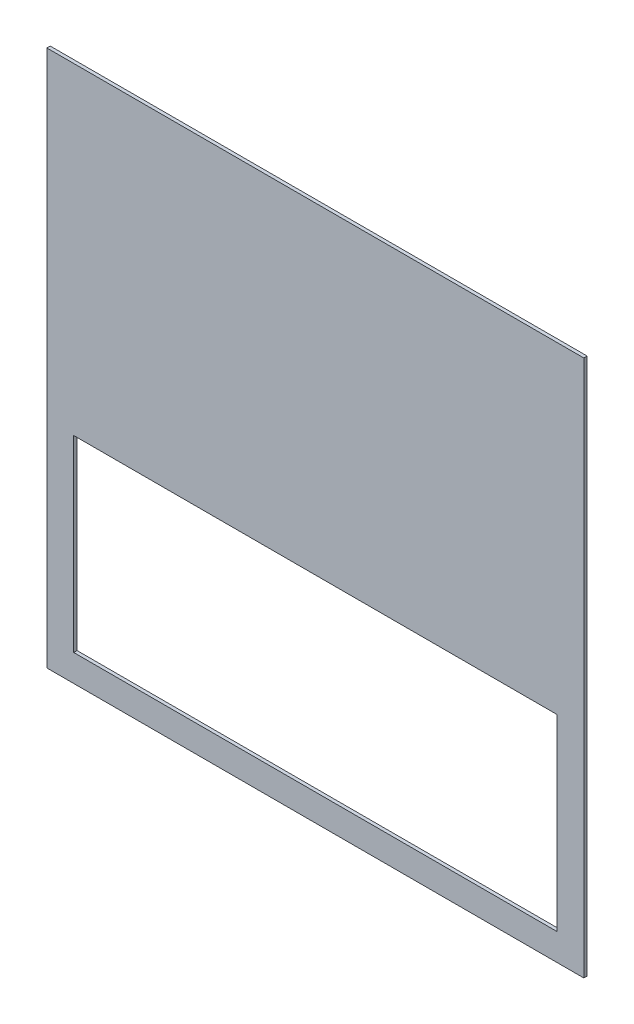
ISO-10303-21;
HEADER;
FILE_DESCRIPTION(('STEP AP214'),'2;1');
FILE_NAME('part.step','',(''),(''),'','','');
FILE_SCHEMA(('AUTOMOTIVE_DESIGN { 1 0 10303 214 1 1 1 1 }'));
ENDSEC;
DATA;
#1=APPLICATION_CONTEXT('core data for automotive mechanical design processes');
#2=APPLICATION_PROTOCOL_DEFINITION('international standard','automotive_design',2000,#1);
#3=PRODUCT_CONTEXT('',#1,'mechanical');
#4=PRODUCT('Part','Part','',(#3));
#5=PRODUCT_RELATED_PRODUCT_CATEGORY('part','',(#4));
#6=PRODUCT_DEFINITION_FORMATION('','',#4);
#7=PRODUCT_DEFINITION_CONTEXT('part definition',#1,'design');
#8=PRODUCT_DEFINITION('design','',#6,#7);
#9=PRODUCT_DEFINITION_SHAPE('','',#8);
#10=(LENGTH_UNIT() NAMED_UNIT(*) SI_UNIT(.MILLI.,.METRE.));
#11=(NAMED_UNIT(*) PLANE_ANGLE_UNIT() SI_UNIT($,.RADIAN.));
#12=(NAMED_UNIT(*) SI_UNIT($,.STERADIAN.) SOLID_ANGLE_UNIT());
#13=UNCERTAINTY_MEASURE_WITH_UNIT(LENGTH_MEASURE(1.E-05),#10,'distance_accuracy_value','');
#14=(GEOMETRIC_REPRESENTATION_CONTEXT(3) GLOBAL_UNCERTAINTY_ASSIGNED_CONTEXT((#13)) GLOBAL_UNIT_ASSIGNED_CONTEXT((#10,
#11,#12)) REPRESENTATION_CONTEXT('',''));
#15=CARTESIAN_POINT('',(0.,0.,0.));
#16=DIRECTION('',(0.,0.,1.));
#17=DIRECTION('',(1.,0.,0.));
#18=AXIS2_PLACEMENT_3D('',#15,#16,#17);
#19=CARTESIAN_POINT('',(254.,-254.,1.5875));
#20=DIRECTION('',(-1.,0.,0.));
#21=DIRECTION('',(0.,0.,1.));
#22=AXIS2_PLACEMENT_3D('',#19,#20,#21);
#23=PLANE('',#22);
#24=DIRECTION('',(0.,1.,0.));
#25=VECTOR('',#24,1.);
#26=CARTESIAN_POINT('',(254.,-254.,-1.5875));
#27=LINE('',#26,#25);
#28=CARTESIAN_POINT('',(254.,-254.,-1.5875));
#29=VERTEX_POINT('',#28);
#30=CARTESIAN_POINT('',(254.,254.,-1.5875));
#31=VERTEX_POINT('',#30);
#32=EDGE_CURVE('E134',#29,#31,#27,.T.);
#33=ORIENTED_EDGE('',*,*,#32,.T.);
#34=DIRECTION('',(0.,0.,-1.));
#35=VECTOR('',#34,1.);
#36=CARTESIAN_POINT('',(254.,254.,1.5875));
#37=LINE('',#36,#35);
#38=CARTESIAN_POINT('',(254.,254.,1.5875));
#39=VERTEX_POINT('',#38);
#40=EDGE_CURVE('E11',#39,#31,#37,.T.);
#41=ORIENTED_EDGE('',*,*,#40,.F.);
#42=DIRECTION('',(0.,1.,0.));
#43=VECTOR('',#42,1.);
#44=CARTESIAN_POINT('',(254.,-254.,1.5875));
#45=LINE('',#44,#43);
#46=CARTESIAN_POINT('',(254.,-254.,1.5875));
#47=VERTEX_POINT('',#46);
#48=EDGE_CURVE('E138',#47,#39,#45,.T.);
#49=ORIENTED_EDGE('',*,*,#48,.F.);
#50=DIRECTION('',(0.,0.,-1.));
#51=VECTOR('',#50,1.);
#52=CARTESIAN_POINT('',(254.,-254.,1.5875));
#53=LINE('',#52,#51);
#54=EDGE_CURVE('E148',#47,#29,#53,.T.);
#55=ORIENTED_EDGE('',*,*,#54,.T.);
#56=EDGE_LOOP('',(#33,#41,#49,#55));
#57=FACE_BOUND('',#56,.T.);
#58=ADVANCED_FACE('F37',(#57),#23,.F.);
#59=CARTESIAN_POINT('',(-254.,254.,1.5875));
#60=DIRECTION('',(0.,-1.,0.));
#61=DIRECTION('',(0.,0.,-1.));
#62=AXIS2_PLACEMENT_3D('',#59,#60,#61);
#63=PLANE('',#62);
#64=DIRECTION('',(-1.,0.,0.));
#65=VECTOR('',#64,1.);
#66=CARTESIAN_POINT('',(-254.,254.,-1.5875));
#67=LINE('',#66,#65);
#68=CARTESIAN_POINT('',(-254.,254.,-1.5875));
#69=VERTEX_POINT('',#68);
#70=EDGE_CURVE('E151',#31,#69,#67,.T.);
#71=ORIENTED_EDGE('',*,*,#70,.T.);
#72=DIRECTION('',(0.,0.,-1.));
#73=VECTOR('',#72,1.);
#74=CARTESIAN_POINT('',(-254.,254.,1.5875));
#75=LINE('',#74,#73);
#76=CARTESIAN_POINT('',(-254.,254.,1.5875));
#77=VERTEX_POINT('',#76);
#78=EDGE_CURVE('E44',#77,#69,#75,.T.);
#79=ORIENTED_EDGE('',*,*,#78,.F.);
#80=DIRECTION('',(-1.,0.,0.));
#81=VECTOR('',#80,1.);
#82=CARTESIAN_POINT('',(-254.,254.,1.5875));
#83=LINE('',#82,#81);
#84=EDGE_CURVE('E141',#39,#77,#83,.T.);
#85=ORIENTED_EDGE('',*,*,#84,.F.);
#86=ORIENTED_EDGE('',*,*,#40,.T.);
#87=EDGE_LOOP('',(#71,#79,#85,#86));
#88=FACE_BOUND('',#87,.T.);
#89=ADVANCED_FACE('F179',(#88),#63,.F.);
#90=CARTESIAN_POINT('',(-254.,-254.,1.5875));
#91=DIRECTION('',(1.,0.,0.));
#92=DIRECTION('',(0.,0.,-1.));
#93=AXIS2_PLACEMENT_3D('',#90,#91,#92);
#94=PLANE('',#93);
#95=DIRECTION('',(0.,-1.,0.));
#96=VECTOR('',#95,1.);
#97=CARTESIAN_POINT('',(-254.,-254.,-1.5875));
#98=LINE('',#97,#96);
#99=CARTESIAN_POINT('',(-254.,-254.,-1.5875));
#100=VERTEX_POINT('',#99);
#101=EDGE_CURVE('E153',#69,#100,#98,.T.);
#102=ORIENTED_EDGE('',*,*,#101,.T.);
#103=DIRECTION('',(0.,0.,-1.));
#104=VECTOR('',#103,1.);
#105=CARTESIAN_POINT('',(-254.,-254.,1.5875));
#106=LINE('',#105,#104);
#107=CARTESIAN_POINT('',(-254.,-254.,1.5875));
#108=VERTEX_POINT('',#107);
#109=EDGE_CURVE('E158',#108,#100,#106,.T.);
#110=ORIENTED_EDGE('',*,*,#109,.F.);
#111=DIRECTION('',(0.,-1.,0.));
#112=VECTOR('',#111,1.);
#113=CARTESIAN_POINT('',(-254.,-254.,1.5875));
#114=LINE('',#113,#112);
#115=EDGE_CURVE('E144',#77,#108,#114,.T.);
#116=ORIENTED_EDGE('',*,*,#115,.F.);
#117=ORIENTED_EDGE('',*,*,#78,.T.);
#118=EDGE_LOOP('',(#102,#110,#116,#117));
#119=FACE_BOUND('',#118,.T.);
#120=ADVANCED_FACE('F165',(#119),#94,.F.);
#121=CARTESIAN_POINT('',(-254.,-254.,1.5875));
#122=DIRECTION('',(0.,1.,0.));
#123=DIRECTION('',(0.,0.,1.));
#124=AXIS2_PLACEMENT_3D('',#121,#122,#123);
#125=PLANE('',#124);
#126=DIRECTION('',(1.,0.,0.));
#127=VECTOR('',#126,1.);
#128=CARTESIAN_POINT('',(-254.,-254.,-1.5875));
#129=LINE('',#128,#127);
#130=EDGE_CURVE('E142',#100,#29,#129,.T.);
#131=ORIENTED_EDGE('',*,*,#130,.T.);
#132=ORIENTED_EDGE('',*,*,#54,.F.);
#133=DIRECTION('',(1.,0.,0.));
#134=VECTOR('',#133,1.);
#135=CARTESIAN_POINT('',(-254.,-254.,1.5875));
#136=LINE('',#135,#134);
#137=EDGE_CURVE('E146',#108,#47,#136,.T.);
#138=ORIENTED_EDGE('',*,*,#137,.F.);
#139=ORIENTED_EDGE('',*,*,#109,.T.);
#140=EDGE_LOOP('',(#131,#132,#138,#139));
#141=FACE_BOUND('',#140,.T.);
#142=ADVANCED_FACE('F174',(#141),#125,.F.);
#143=CARTESIAN_POINT('',(0.,0.,1.5875));
#144=DIRECTION('',(0.,0.,-1.));
#145=DIRECTION('',(-1.,0.,0.));
#146=AXIS2_PLACEMENT_3D('',#143,#144,#145);
#147=PLANE('',#146);
#148=DIRECTION('',(1.,0.,0.));
#149=VECTOR('',#148,1.);
#150=CARTESIAN_POINT('',(228.6,-50.8,1.5875));
#151=LINE('',#150,#149);
#152=CARTESIAN_POINT('',(-228.6,-50.8,1.5875));
#153=VERTEX_POINT('',#152);
#154=CARTESIAN_POINT('',(228.6,-50.8,1.5875));
#155=VERTEX_POINT('',#154);
#156=EDGE_CURVE('E109',#153,#155,#151,.T.);
#157=ORIENTED_EDGE('',*,*,#156,.T.);
#158=DIRECTION('',(0.,-1.,0.));
#159=VECTOR('',#158,1.);
#160=CARTESIAN_POINT('',(228.6,-228.6,1.5875));
#161=LINE('',#160,#159);
#162=CARTESIAN_POINT('',(228.6,-228.6,1.5875));
#163=VERTEX_POINT('',#162);
#164=EDGE_CURVE('E103',#155,#163,#161,.T.);
#165=ORIENTED_EDGE('',*,*,#164,.T.);
#166=DIRECTION('',(-1.,0.,0.));
#167=VECTOR('',#166,1.);
#168=CARTESIAN_POINT('',(228.6,-228.6,1.5875));
#169=LINE('',#168,#167);
#170=CARTESIAN_POINT('',(-228.6,-228.6,1.5875));
#171=VERTEX_POINT('',#170);
#172=EDGE_CURVE('E112',#163,#171,#169,.T.);
#173=ORIENTED_EDGE('',*,*,#172,.T.);
#174=DIRECTION('',(0.,1.,0.));
#175=VECTOR('',#174,1.);
#176=CARTESIAN_POINT('',(-228.6,-228.6,1.5875));
#177=LINE('',#176,#175);
#178=EDGE_CURVE('E51',#171,#153,#177,.T.);
#179=ORIENTED_EDGE('',*,*,#178,.T.);
#180=EDGE_LOOP('',(#157,#165,#173,#179));
#181=FACE_BOUND('',#180,.T.);
#182=ORIENTED_EDGE('',*,*,#48,.T.);
#183=ORIENTED_EDGE('',*,*,#84,.T.);
#184=ORIENTED_EDGE('',*,*,#115,.T.);
#185=ORIENTED_EDGE('',*,*,#137,.T.);
#186=EDGE_LOOP('',(#182,#183,#184,#185));
#187=FACE_BOUND('',#186,.T.);
#188=ADVANCED_FACE('F116',(#181,#187),#147,.F.);
#189=CARTESIAN_POINT('',(0.,0.,-1.5875));
#190=DIRECTION('',(0.,0.,-1.));
#191=DIRECTION('',(-1.,0.,0.));
#192=AXIS2_PLACEMENT_3D('',#189,#190,#191);
#193=PLANE('',#192);
#194=DIRECTION('',(0.,-1.,0.));
#195=VECTOR('',#194,1.);
#196=CARTESIAN_POINT('',(228.6,-228.6,-1.5875));
#197=LINE('',#196,#195);
#198=CARTESIAN_POINT('',(228.6,-50.8,-1.5875));
#199=VERTEX_POINT('',#198);
#200=CARTESIAN_POINT('',(228.6,-228.6,-1.5875));
#201=VERTEX_POINT('',#200);
#202=EDGE_CURVE('E59',#199,#201,#197,.T.);
#203=ORIENTED_EDGE('',*,*,#202,.F.);
#204=DIRECTION('',(1.,0.,0.));
#205=VECTOR('',#204,1.);
#206=CARTESIAN_POINT('',(228.6,-50.8,-1.5875));
#207=LINE('',#206,#205);
#208=CARTESIAN_POINT('',(-228.6,-50.8,-1.5875));
#209=VERTEX_POINT('',#208);
#210=EDGE_CURVE('E119',#209,#199,#207,.T.);
#211=ORIENTED_EDGE('',*,*,#210,.F.);
#212=DIRECTION('',(0.,1.,0.));
#213=VECTOR('',#212,1.);
#214=CARTESIAN_POINT('',(-228.6,-228.6,-1.5875));
#215=LINE('',#214,#213);
#216=CARTESIAN_POINT('',(-228.6,-228.6,-1.5875));
#217=VERTEX_POINT('',#216);
#218=EDGE_CURVE('E122',#217,#209,#215,.T.);
#219=ORIENTED_EDGE('',*,*,#218,.F.);
#220=DIRECTION('',(-1.,0.,0.));
#221=VECTOR('',#220,1.);
#222=CARTESIAN_POINT('',(228.6,-228.6,-1.5875));
#223=LINE('',#222,#221);
#224=EDGE_CURVE('E128',#201,#217,#223,.T.);
#225=ORIENTED_EDGE('',*,*,#224,.F.);
#226=EDGE_LOOP('',(#203,#211,#219,#225));
#227=FACE_BOUND('',#226,.T.);
#228=ORIENTED_EDGE('',*,*,#32,.F.);
#229=ORIENTED_EDGE('',*,*,#130,.F.);
#230=ORIENTED_EDGE('',*,*,#101,.F.);
#231=ORIENTED_EDGE('',*,*,#70,.F.);
#232=EDGE_LOOP('',(#228,#229,#230,#231));
#233=FACE_BOUND('',#232,.T.);
#234=ADVANCED_FACE('F171',(#227,#233),#193,.T.);
#235=CARTESIAN_POINT('',(228.6,-228.6,1.5875));
#236=DIRECTION('',(1.,0.,0.));
#237=DIRECTION('',(0.,1.,0.));
#238=AXIS2_PLACEMENT_3D('',#235,#236,#237);
#239=PLANE('',#238);
#240=ORIENTED_EDGE('',*,*,#202,.T.);
#241=DIRECTION('',(0.,0.,-1.));
#242=VECTOR('',#241,1.);
#243=CARTESIAN_POINT('',(228.6,-228.6,1.5875));
#244=LINE('',#243,#242);
#245=EDGE_CURVE('E99',#163,#201,#244,.T.);
#246=ORIENTED_EDGE('',*,*,#245,.F.);
#247=ORIENTED_EDGE('',*,*,#164,.F.);
#248=DIRECTION('',(0.,0.,-1.));
#249=VECTOR('',#248,1.);
#250=CARTESIAN_POINT('',(228.6,-50.8,1.5875));
#251=LINE('',#250,#249);
#252=EDGE_CURVE('E132',#155,#199,#251,.T.);
#253=ORIENTED_EDGE('',*,*,#252,.T.);
#254=EDGE_LOOP('',(#240,#246,#247,#253));
#255=FACE_BOUND('',#254,.T.);
#256=ADVANCED_FACE('F101',(#255),#239,.F.);
#257=CARTESIAN_POINT('',(228.6,-50.8,1.5875));
#258=DIRECTION('',(0.,1.,0.));
#259=DIRECTION('',(0.,0.,1.));
#260=AXIS2_PLACEMENT_3D('',#257,#258,#259);
#261=PLANE('',#260);
#262=ORIENTED_EDGE('',*,*,#210,.T.);
#263=ORIENTED_EDGE('',*,*,#252,.F.);
#264=ORIENTED_EDGE('',*,*,#156,.F.);
#265=DIRECTION('',(0.,0.,-1.));
#266=VECTOR('',#265,1.);
#267=CARTESIAN_POINT('',(-228.6,-50.8,1.5875));
#268=LINE('',#267,#266);
#269=EDGE_CURVE('E135',#153,#209,#268,.T.);
#270=ORIENTED_EDGE('',*,*,#269,.T.);
#271=EDGE_LOOP('',(#262,#263,#264,#270));
#272=FACE_BOUND('',#271,.T.);
#273=ADVANCED_FACE('F196',(#272),#261,.F.);
#274=CARTESIAN_POINT('',(-228.6,-228.6,1.5875));
#275=DIRECTION('',(-1.,0.,0.));
#276=DIRECTION('',(0.,-1.,0.));
#277=AXIS2_PLACEMENT_3D('',#274,#275,#276);
#278=PLANE('',#277);
#279=ORIENTED_EDGE('',*,*,#218,.T.);
#280=ORIENTED_EDGE('',*,*,#269,.F.);
#281=ORIENTED_EDGE('',*,*,#178,.F.);
#282=DIRECTION('',(0.,0.,-1.));
#283=VECTOR('',#282,1.);
#284=CARTESIAN_POINT('',(-228.6,-228.6,1.5875));
#285=LINE('',#284,#283);
#286=EDGE_CURVE('E108',#171,#217,#285,.T.);
#287=ORIENTED_EDGE('',*,*,#286,.T.);
#288=EDGE_LOOP('',(#279,#280,#281,#287));
#289=FACE_BOUND('',#288,.T.);
#290=ADVANCED_FACE('F199',(#289),#278,.F.);
#291=CARTESIAN_POINT('',(228.6,-228.6,1.5875));
#292=DIRECTION('',(0.,-1.,0.));
#293=DIRECTION('',(1.,0.,0.));
#294=AXIS2_PLACEMENT_3D('',#291,#292,#293);
#295=PLANE('',#294);
#296=ORIENTED_EDGE('',*,*,#224,.T.);
#297=ORIENTED_EDGE('',*,*,#286,.F.);
#298=ORIENTED_EDGE('',*,*,#172,.F.);
#299=ORIENTED_EDGE('',*,*,#245,.T.);
#300=EDGE_LOOP('',(#296,#297,#298,#299));
#301=FACE_BOUND('',#300,.T.);
#302=ADVANCED_FACE('F113',(#301),#295,.F.);
#303=CLOSED_SHELL('',(#58,#89,#120,#142,#188,#234,#256,#273,#290,#302));
#304=MANIFOLD_SOLID_BREP('B2',#303);
#305=ADVANCED_BREP_SHAPE_REPRESENTATION('',(#18,#304),#14);
#306=SHAPE_DEFINITION_REPRESENTATION(#9,#305);
ENDSEC;
END-ISO-10303-21;
